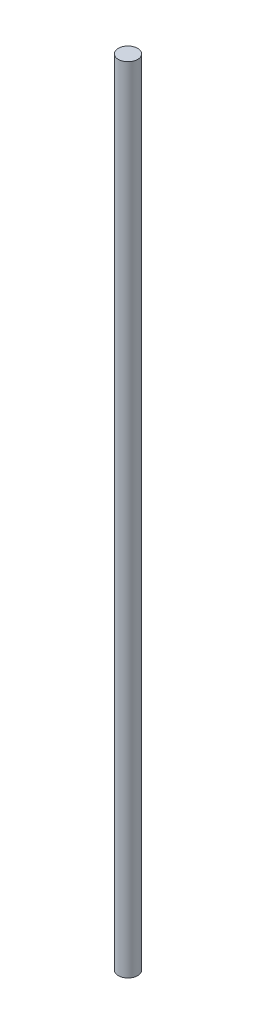
ISO-10303-21;
HEADER;
FILE_DESCRIPTION(('STEP AP214'),'2;1');
FILE_NAME('part.step','',(''),(''),'','','');
FILE_SCHEMA(('AUTOMOTIVE_DESIGN { 1 0 10303 214 1 1 1 1 }'));
ENDSEC;
DATA;
#1=APPLICATION_CONTEXT('core data for automotive mechanical design processes');
#2=APPLICATION_PROTOCOL_DEFINITION('international standard','automotive_design',2000,#1);
#3=PRODUCT_CONTEXT('',#1,'mechanical');
#4=PRODUCT('Part','Part','',(#3));
#5=PRODUCT_RELATED_PRODUCT_CATEGORY('part','',(#4));
#6=PRODUCT_DEFINITION_FORMATION('','',#4);
#7=PRODUCT_DEFINITION_CONTEXT('part definition',#1,'design');
#8=PRODUCT_DEFINITION('design','',#6,#7);
#9=PRODUCT_DEFINITION_SHAPE('','',#8);
#10=(LENGTH_UNIT() NAMED_UNIT(*) SI_UNIT(.MILLI.,.METRE.));
#11=(NAMED_UNIT(*) PLANE_ANGLE_UNIT() SI_UNIT($,.RADIAN.));
#12=(NAMED_UNIT(*) SI_UNIT($,.STERADIAN.) SOLID_ANGLE_UNIT());
#13=UNCERTAINTY_MEASURE_WITH_UNIT(LENGTH_MEASURE(1.E-05),#10,'distance_accuracy_value','');
#14=(GEOMETRIC_REPRESENTATION_CONTEXT(3) GLOBAL_UNCERTAINTY_ASSIGNED_CONTEXT((#13)) GLOBAL_UNIT_ASSIGNED_CONTEXT((#10,
#11,#12)) REPRESENTATION_CONTEXT('',''));
#15=CARTESIAN_POINT('',(0.,0.,0.));
#16=DIRECTION('',(0.,0.,1.));
#17=DIRECTION('',(1.,0.,0.));
#18=AXIS2_PLACEMENT_3D('',#15,#16,#17);
#19=CARTESIAN_POINT('',(2.5,412.,18.));
#20=DIRECTION('',(0.,1.,0.));
#21=DIRECTION('',(0.,0.,1.));
#22=AXIS2_PLACEMENT_3D('',#19,#20,#21);
#23=PLANE('',#22);
#24=CARTESIAN_POINT('',(0.,412.,18.));
#25=DIRECTION('',(0.,1.,0.));
#26=DIRECTION('',(0.,0.,1.));
#27=AXIS2_PLACEMENT_3D('',#24,#25,#26);
#28=CIRCLE('',#27,5.);
#29=CARTESIAN_POINT('',(0.,412.,23.));
#30=VERTEX_POINT('',#29);
#31=EDGE_CURVE('E20',#30,#30,#28,.F.);
#32=ORIENTED_EDGE('',*,*,#31,.F.);
#33=EDGE_LOOP('',(#32));
#34=FACE_BOUND('',#33,.T.);
#35=ADVANCED_FACE('F16',(#34),#23,.T.);
#36=CARTESIAN_POINT('',(2.5,0.,18.));
#37=DIRECTION('',(0.,-1.,0.));
#38=DIRECTION('',(0.,0.,-1.));
#39=AXIS2_PLACEMENT_3D('',#36,#37,#38);
#40=PLANE('',#39);
#41=CARTESIAN_POINT('',(0.,0.,18.));
#42=DIRECTION('',(0.,1.,0.));
#43=DIRECTION('',(0.,0.,1.));
#44=AXIS2_PLACEMENT_3D('',#41,#42,#43);
#45=CIRCLE('',#44,5.);
#46=CARTESIAN_POINT('',(0.,0.,23.));
#47=VERTEX_POINT('',#46);
#48=EDGE_CURVE('E11',#47,#47,#45,.T.);
#49=ORIENTED_EDGE('',*,*,#48,.F.);
#50=EDGE_LOOP('',(#49));
#51=FACE_BOUND('',#50,.T.);
#52=ADVANCED_FACE('F35',(#51),#40,.T.);
#53=CARTESIAN_POINT('',(0.,197.5,18.));
#54=DIRECTION('',(0.,1.,0.));
#55=DIRECTION('',(0.,0.,1.));
#56=AXIS2_PLACEMENT_3D('',#53,#54,#55);
#57=CYLINDRICAL_SURFACE('',#56,5.);
#58=ORIENTED_EDGE('',*,*,#31,.T.);
#59=EDGE_LOOP('',(#58));
#60=FACE_BOUND('',#59,.T.);
#61=ORIENTED_EDGE('',*,*,#48,.T.);
#62=EDGE_LOOP('',(#61));
#63=FACE_BOUND('',#62,.T.);
#64=ADVANCED_FACE('F32',(#60,#63),#57,.T.);
#65=CLOSED_SHELL('',(#35,#52,#64));
#66=MANIFOLD_SOLID_BREP('B1',#65);
#67=ADVANCED_BREP_SHAPE_REPRESENTATION('',(#18,#66),#14);
#68=SHAPE_DEFINITION_REPRESENTATION(#9,#67);
ENDSEC;
END-ISO-10303-21;
